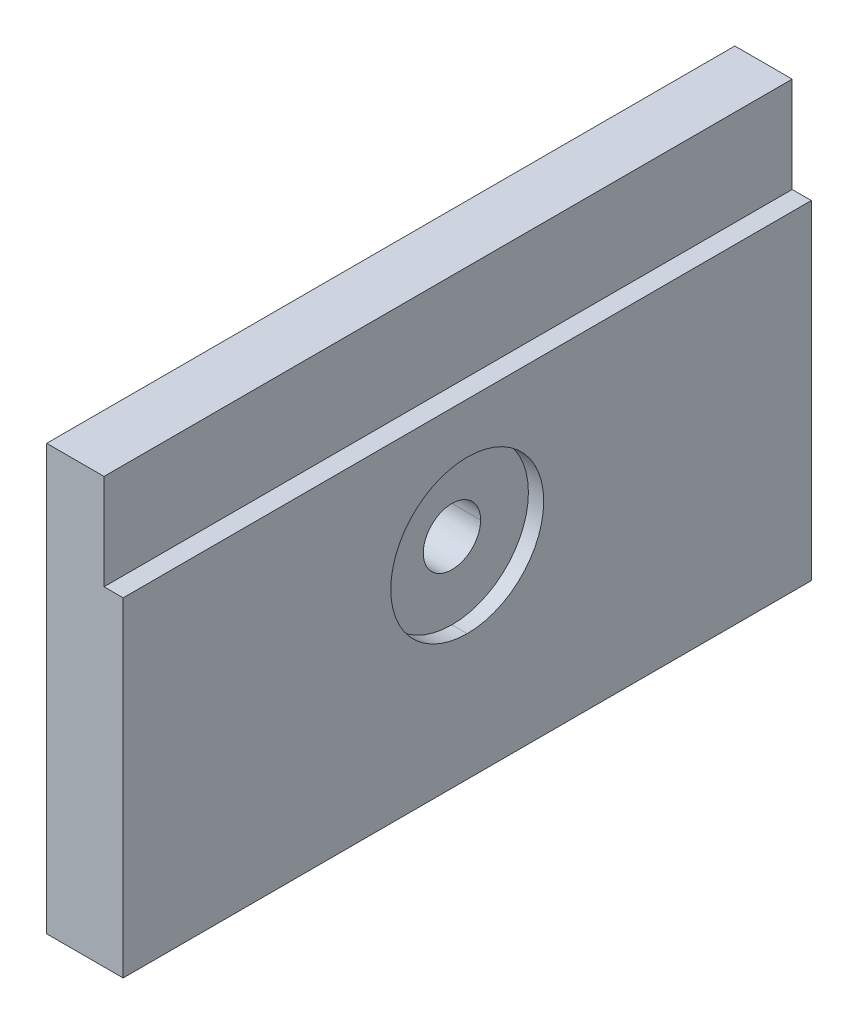
ISO-10303-21;
HEADER;
FILE_DESCRIPTION(('STEP AP214'),'2;1');
FILE_NAME('part.step','',(''),(''),'','','');
FILE_SCHEMA(('AUTOMOTIVE_DESIGN { 1 0 10303 214 1 1 1 1 }'));
ENDSEC;
DATA;
#1=APPLICATION_CONTEXT('core data for automotive mechanical design processes');
#2=APPLICATION_PROTOCOL_DEFINITION('international standard','automotive_design',2000,#1);
#3=PRODUCT_CONTEXT('',#1,'mechanical');
#4=PRODUCT('Part','Part','',(#3));
#5=PRODUCT_RELATED_PRODUCT_CATEGORY('part','',(#4));
#6=PRODUCT_DEFINITION_FORMATION('','',#4);
#7=PRODUCT_DEFINITION_CONTEXT('part definition',#1,'design');
#8=PRODUCT_DEFINITION('design','',#6,#7);
#9=PRODUCT_DEFINITION_SHAPE('','',#8);
#10=(LENGTH_UNIT() NAMED_UNIT(*) SI_UNIT(.MILLI.,.METRE.));
#11=(NAMED_UNIT(*) PLANE_ANGLE_UNIT() SI_UNIT($,.RADIAN.));
#12=(NAMED_UNIT(*) SI_UNIT($,.STERADIAN.) SOLID_ANGLE_UNIT());
#13=UNCERTAINTY_MEASURE_WITH_UNIT(LENGTH_MEASURE(1.E-05),#10,'distance_accuracy_value','');
#14=(GEOMETRIC_REPRESENTATION_CONTEXT(3) GLOBAL_UNCERTAINTY_ASSIGNED_CONTEXT((#13)) GLOBAL_UNIT_ASSIGNED_CONTEXT((#10,
#11,#12)) REPRESENTATION_CONTEXT('',''));
#15=CARTESIAN_POINT('',(0.,0.,0.));
#16=DIRECTION('',(0.,0.,1.));
#17=DIRECTION('',(1.,0.,0.));
#18=AXIS2_PLACEMENT_3D('',#15,#16,#17);
#19=CARTESIAN_POINT('',(-2.54,33.655,-57.15));
#20=DIRECTION('',(1.,0.,0.));
#21=DIRECTION('',(0.,1.,0.));
#22=AXIS2_PLACEMENT_3D('',#19,#20,#21);
#23=CYLINDRICAL_SURFACE('',#22,12.7);
#24=DIRECTION('',(1.,0.,0.));
#25=VECTOR('',#24,1.);
#26=CARTESIAN_POINT('',(-2.54,20.955,-57.15));
#27=LINE('',#26,#25);
#28=CARTESIAN_POINT('',(-2.54,20.955,-57.15));
#29=VERTEX_POINT('',#28);
#30=CARTESIAN_POINT('',(0.,20.955,-57.15));
#31=VERTEX_POINT('',#30);
#32=EDGE_CURVE('E128',#29,#31,#27,.T.);
#33=ORIENTED_EDGE('',*,*,#32,.F.);
#34=CARTESIAN_POINT('',(-2.54,33.655,-57.15));
#35=DIRECTION('',(1.,0.,0.));
#36=DIRECTION('',(0.,1.,0.));
#37=AXIS2_PLACEMENT_3D('',#34,#35,#36);
#38=CIRCLE('',#37,12.7);
#39=CARTESIAN_POINT('',(-2.54,46.355,-57.15));
#40=VERTEX_POINT('',#39);
#41=EDGE_CURVE('E11',#40,#29,#38,.T.);
#42=ORIENTED_EDGE('',*,*,#41,.F.);
#43=DIRECTION('',(1.,0.,0.));
#44=VECTOR('',#43,1.);
#45=CARTESIAN_POINT('',(-2.54,46.355,-57.15));
#46=LINE('',#45,#44);
#47=CARTESIAN_POINT('',(0.,46.355,-57.15));
#48=VERTEX_POINT('',#47);
#49=EDGE_CURVE('E137',#40,#48,#46,.T.);
#50=ORIENTED_EDGE('',*,*,#49,.T.);
#51=CARTESIAN_POINT('',(0.,33.655,-57.15));
#52=DIRECTION('',(1.,0.,0.));
#53=DIRECTION('',(0.,1.,0.));
#54=AXIS2_PLACEMENT_3D('',#51,#52,#53);
#55=CIRCLE('',#54,12.7);
#56=EDGE_CURVE('E129',#48,#31,#55,.T.);
#57=ORIENTED_EDGE('',*,*,#56,.T.);
#58=EDGE_LOOP('',(#33,#42,#50,#57));
#59=FACE_BOUND('',#58,.T.);
#60=ADVANCED_FACE('F17',(#59),#23,.F.);
#61=CARTESIAN_POINT('',(-2.54,33.655,-57.15));
#62=DIRECTION('',(1.,0.,0.));
#63=DIRECTION('',(0.,-1.,0.));
#64=AXIS2_PLACEMENT_3D('',#61,#62,#63);
#65=PLANE('',#64);
#66=CARTESIAN_POINT('',(-2.54,33.655,-57.15));
#67=DIRECTION('',(-1.,0.,0.));
#68=DIRECTION('',(0.,1.,0.));
#69=AXIS2_PLACEMENT_3D('',#66,#67,#68);
#70=CIRCLE('',#69,4.7625);
#71=CARTESIAN_POINT('',(-2.54,33.655,-61.9125));
#72=VERTEX_POINT('',#71);
#73=CARTESIAN_POINT('',(-2.54,33.655,-52.3875));
#74=VERTEX_POINT('',#73);
#75=EDGE_CURVE('E154',#72,#74,#70,.T.);
#76=ORIENTED_EDGE('',*,*,#75,.T.);
#77=CARTESIAN_POINT('',(-2.54,33.655,-57.15));
#78=DIRECTION('',(-1.,0.,0.));
#79=DIRECTION('',(0.,1.,0.));
#80=AXIS2_PLACEMENT_3D('',#77,#78,#79);
#81=CIRCLE('',#80,4.7625);
#82=EDGE_CURVE('E163',#74,#72,#81,.T.);
#83=ORIENTED_EDGE('',*,*,#82,.T.);
#84=EDGE_LOOP('',(#76,#83));
#85=FACE_BOUND('',#84,.T.);
#86=ORIENTED_EDGE('',*,*,#41,.T.);
#87=CARTESIAN_POINT('',(-2.54,33.655,-57.15));
#88=DIRECTION('',(1.,0.,0.));
#89=DIRECTION('',(0.,1.,0.));
#90=AXIS2_PLACEMENT_3D('',#87,#88,#89);
#91=CIRCLE('',#90,12.7);
#92=EDGE_CURVE('E123',#29,#40,#91,.T.);
#93=ORIENTED_EDGE('',*,*,#92,.T.);
#94=EDGE_LOOP('',(#86,#93));
#95=FACE_BOUND('',#94,.T.);
#96=ADVANCED_FACE('F121',(#85,#95),#65,.T.);
#97=CARTESIAN_POINT('',(0.,54.6862,0.));
#98=DIRECTION('',(0.,0.,1.));
#99=DIRECTION('',(1.,0.,0.));
#100=AXIS2_PLACEMENT_3D('',#97,#98,#99);
#101=PLANE('',#100);
#102=DIRECTION('',(0.,1.,0.));
#103=VECTOR('',#102,1.);
#104=CARTESIAN_POINT('',(0.,54.6862,0.));
#105=LINE('',#104,#103);
#106=CARTESIAN_POINT('',(0.,0.,0.));
#107=VERTEX_POINT('',#106);
#108=CARTESIAN_POINT('',(0.,54.6862,0.));
#109=VERTEX_POINT('',#108);
#110=EDGE_CURVE('E196',#107,#109,#105,.T.);
#111=ORIENTED_EDGE('',*,*,#110,.T.);
#112=DIRECTION('',(-1.,0.,0.));
#113=VECTOR('',#112,1.);
#114=CARTESIAN_POINT('',(-3.17500000000004,54.6862,0.));
#115=LINE('',#114,#113);
#116=CARTESIAN_POINT('',(-3.17500000000004,54.6862,0.));
#117=VERTEX_POINT('',#116);
#118=EDGE_CURVE('E20',#109,#117,#115,.T.);
#119=ORIENTED_EDGE('',*,*,#118,.T.);
#120=DIRECTION('',(0.,1.,0.));
#121=VECTOR('',#120,1.);
#122=CARTESIAN_POINT('',(-3.17500000000004,70.5612,0.));
#123=LINE('',#122,#121);
#124=CARTESIAN_POINT('',(-3.17500000000004,70.5612,0.));
#125=VERTEX_POINT('',#124);
#126=EDGE_CURVE('E207',#117,#125,#123,.T.);
#127=ORIENTED_EDGE('',*,*,#126,.T.);
#128=DIRECTION('',(-1.,0.,0.));
#129=VECTOR('',#128,1.);
#130=CARTESIAN_POINT('',(-12.7,70.5612,0.));
#131=LINE('',#130,#129);
#132=CARTESIAN_POINT('',(-12.7,70.5612,0.));
#133=VERTEX_POINT('',#132);
#134=EDGE_CURVE('E215',#125,#133,#131,.T.);
#135=ORIENTED_EDGE('',*,*,#134,.T.);
#136=DIRECTION('',(0.,-1.,0.));
#137=VECTOR('',#136,1.);
#138=CARTESIAN_POINT('',(-12.7,0.,0.));
#139=LINE('',#138,#137);
#140=CARTESIAN_POINT('',(-12.7,0.,0.));
#141=VERTEX_POINT('',#140);
#142=EDGE_CURVE('E160',#133,#141,#139,.T.);
#143=ORIENTED_EDGE('',*,*,#142,.T.);
#144=DIRECTION('',(1.,0.,0.));
#145=VECTOR('',#144,1.);
#146=CARTESIAN_POINT('',(0.,0.,0.));
#147=LINE('',#146,#145);
#148=EDGE_CURVE('E168',#141,#107,#147,.T.);
#149=ORIENTED_EDGE('',*,*,#148,.T.);
#150=EDGE_LOOP('',(#111,#119,#127,#135,#143,#149));
#151=FACE_BOUND('',#150,.T.);
#152=ADVANCED_FACE('F235',(#151),#101,.T.);
#153=CARTESIAN_POINT('',(0.,54.6862,-114.3));
#154=DIRECTION('',(0.,0.,1.));
#155=DIRECTION('',(1.,0.,0.));
#156=AXIS2_PLACEMENT_3D('',#153,#154,#155);
#157=PLANE('',#156);
#158=DIRECTION('',(0.,1.,0.));
#159=VECTOR('',#158,1.);
#160=CARTESIAN_POINT('',(0.,54.6862,-114.3));
#161=LINE('',#160,#159);
#162=CARTESIAN_POINT('',(0.,0.,-114.3));
#163=VERTEX_POINT('',#162);
#164=CARTESIAN_POINT('',(0.,54.6862,-114.3));
#165=VERTEX_POINT('',#164);
#166=EDGE_CURVE('E143',#163,#165,#161,.T.);
#167=ORIENTED_EDGE('',*,*,#166,.F.);
#168=DIRECTION('',(1.,0.,0.));
#169=VECTOR('',#168,1.);
#170=CARTESIAN_POINT('',(0.,0.,-114.3));
#171=LINE('',#170,#169);
#172=CARTESIAN_POINT('',(-12.7,0.,-114.3));
#173=VERTEX_POINT('',#172);
#174=EDGE_CURVE('E190',#173,#163,#171,.T.);
#175=ORIENTED_EDGE('',*,*,#174,.F.);
#176=DIRECTION('',(0.,-1.,0.));
#177=VECTOR('',#176,1.);
#178=CARTESIAN_POINT('',(-12.7,0.,-114.3));
#179=LINE('',#178,#177);
#180=CARTESIAN_POINT('',(-12.7,70.5612,-114.3));
#181=VERTEX_POINT('',#180);
#182=EDGE_CURVE('E159',#181,#173,#179,.T.);
#183=ORIENTED_EDGE('',*,*,#182,.F.);
#184=DIRECTION('',(-1.,0.,0.));
#185=VECTOR('',#184,1.);
#186=CARTESIAN_POINT('',(-12.7,70.5612,-114.3));
#187=LINE('',#186,#185);
#188=CARTESIAN_POINT('',(-3.17500000000004,70.5612,-114.3));
#189=VERTEX_POINT('',#188);
#190=EDGE_CURVE('E204',#189,#181,#187,.T.);
#191=ORIENTED_EDGE('',*,*,#190,.F.);
#192=DIRECTION('',(0.,1.,0.));
#193=VECTOR('',#192,1.);
#194=CARTESIAN_POINT('',(-3.17500000000004,70.5612,-114.3));
#195=LINE('',#194,#193);
#196=CARTESIAN_POINT('',(-3.17500000000004,54.6862,-114.3));
#197=VERTEX_POINT('',#196);
#198=EDGE_CURVE('E182',#197,#189,#195,.T.);
#199=ORIENTED_EDGE('',*,*,#198,.F.);
#200=DIRECTION('',(-1.,0.,0.));
#201=VECTOR('',#200,1.);
#202=CARTESIAN_POINT('',(-3.17500000000004,54.6862,-114.3));
#203=LINE('',#202,#201);
#204=EDGE_CURVE('E26',#165,#197,#203,.T.);
#205=ORIENTED_EDGE('',*,*,#204,.F.);
#206=EDGE_LOOP('',(#167,#175,#183,#191,#199,#205));
#207=FACE_BOUND('',#206,.T.);
#208=ADVANCED_FACE('F255',(#207),#157,.F.);
#209=CARTESIAN_POINT('',(-3.17500000000004,54.6862,-114.3));
#210=DIRECTION('',(0.,1.,0.));
#211=DIRECTION('',(1.,0.,0.));
#212=AXIS2_PLACEMENT_3D('',#209,#210,#211);
#213=PLANE('',#212);
#214=ORIENTED_EDGE('',*,*,#118,.F.);
#215=DIRECTION('',(0.,0.,1.));
#216=VECTOR('',#215,1.);
#217=CARTESIAN_POINT('',(0.,54.6862,-114.3));
#218=LINE('',#217,#216);
#219=EDGE_CURVE('E147',#165,#109,#218,.T.);
#220=ORIENTED_EDGE('',*,*,#219,.F.);
#221=ORIENTED_EDGE('',*,*,#204,.T.);
#222=DIRECTION('',(0.,0.,1.));
#223=VECTOR('',#222,1.);
#224=CARTESIAN_POINT('',(-3.17500000000004,54.6862,-114.3));
#225=LINE('',#224,#223);
#226=EDGE_CURVE('E185',#197,#117,#225,.T.);
#227=ORIENTED_EDGE('',*,*,#226,.T.);
#228=EDGE_LOOP('',(#214,#220,#221,#227));
#229=FACE_BOUND('',#228,.T.);
#230=ADVANCED_FACE('F230',(#229),#213,.T.);
#231=CARTESIAN_POINT('',(-3.17500000000004,70.5612,-114.3));
#232=DIRECTION('',(1.,0.,0.));
#233=DIRECTION('',(0.,1.,0.));
#234=AXIS2_PLACEMENT_3D('',#231,#232,#233);
#235=PLANE('',#234);
#236=ORIENTED_EDGE('',*,*,#126,.F.);
#237=ORIENTED_EDGE('',*,*,#226,.F.);
#238=ORIENTED_EDGE('',*,*,#198,.T.);
#239=DIRECTION('',(0.,0.,1.));
#240=VECTOR('',#239,1.);
#241=CARTESIAN_POINT('',(-3.17500000000004,70.5612,-114.3));
#242=LINE('',#241,#240);
#243=EDGE_CURVE('E208',#189,#125,#242,.T.);
#244=ORIENTED_EDGE('',*,*,#243,.T.);
#245=EDGE_LOOP('',(#236,#237,#238,#244));
#246=FACE_BOUND('',#245,.T.);
#247=ADVANCED_FACE('F232',(#246),#235,.T.);
#248=CARTESIAN_POINT('',(-12.7,70.5612,-114.3));
#249=DIRECTION('',(0.,1.,0.));
#250=DIRECTION('',(1.,0.,0.));
#251=AXIS2_PLACEMENT_3D('',#248,#249,#250);
#252=PLANE('',#251);
#253=ORIENTED_EDGE('',*,*,#134,.F.);
#254=ORIENTED_EDGE('',*,*,#243,.F.);
#255=ORIENTED_EDGE('',*,*,#190,.T.);
#256=DIRECTION('',(0.,0.,1.));
#257=VECTOR('',#256,1.);
#258=CARTESIAN_POINT('',(-12.7,70.5612,-114.3));
#259=LINE('',#258,#257);
#260=EDGE_CURVE('E155',#181,#133,#259,.T.);
#261=ORIENTED_EDGE('',*,*,#260,.T.);
#262=EDGE_LOOP('',(#253,#254,#255,#261));
#263=FACE_BOUND('',#262,.T.);
#264=ADVANCED_FACE('F239',(#263),#252,.T.);
#265=CARTESIAN_POINT('',(-12.7,0.,-114.3));
#266=DIRECTION('',(-1.,0.,0.));
#267=DIRECTION('',(0.,0.,1.));
#268=AXIS2_PLACEMENT_3D('',#265,#266,#267);
#269=PLANE('',#268);
#270=CARTESIAN_POINT('',(-12.7,33.655,-57.15));
#271=DIRECTION('',(1.,0.,0.));
#272=DIRECTION('',(0.,0.,1.));
#273=AXIS2_PLACEMENT_3D('',#270,#271,#272);
#274=CIRCLE('',#273,4.7625);
#275=CARTESIAN_POINT('',(-12.7,33.655,-61.9125));
#276=VERTEX_POINT('',#275);
#277=CARTESIAN_POINT('',(-12.7,33.655,-52.3875));
#278=VERTEX_POINT('',#277);
#279=EDGE_CURVE('E153',#276,#278,#274,.T.);
#280=ORIENTED_EDGE('',*,*,#279,.T.);
#281=CARTESIAN_POINT('',(-12.7,33.655,-57.15));
#282=DIRECTION('',(1.,0.,0.));
#283=DIRECTION('',(0.,0.,1.));
#284=AXIS2_PLACEMENT_3D('',#281,#282,#283);
#285=CIRCLE('',#284,4.7625);
#286=EDGE_CURVE('E171',#278,#276,#285,.T.);
#287=ORIENTED_EDGE('',*,*,#286,.T.);
#288=EDGE_LOOP('',(#280,#287));
#289=FACE_BOUND('',#288,.T.);
#290=ORIENTED_EDGE('',*,*,#142,.F.);
#291=ORIENTED_EDGE('',*,*,#260,.F.);
#292=ORIENTED_EDGE('',*,*,#182,.T.);
#293=DIRECTION('',(0.,0.,1.));
#294=VECTOR('',#293,1.);
#295=CARTESIAN_POINT('',(-12.7,0.,-114.3));
#296=LINE('',#295,#294);
#297=EDGE_CURVE('E186',#173,#141,#296,.T.);
#298=ORIENTED_EDGE('',*,*,#297,.T.);
#299=EDGE_LOOP('',(#290,#291,#292,#298));
#300=FACE_BOUND('',#299,.T.);
#301=ADVANCED_FACE('F243',(#289,#300),#269,.T.);
#302=CARTESIAN_POINT('',(0.,0.,-114.3));
#303=DIRECTION('',(0.,-1.,0.));
#304=DIRECTION('',(0.,0.,-1.));
#305=AXIS2_PLACEMENT_3D('',#302,#303,#304);
#306=PLANE('',#305);
#307=ORIENTED_EDGE('',*,*,#148,.F.);
#308=ORIENTED_EDGE('',*,*,#297,.F.);
#309=ORIENTED_EDGE('',*,*,#174,.T.);
#310=DIRECTION('',(0.,0.,1.));
#311=VECTOR('',#310,1.);
#312=CARTESIAN_POINT('',(0.,0.,-114.3));
#313=LINE('',#312,#311);
#314=EDGE_CURVE('E148',#163,#107,#313,.T.);
#315=ORIENTED_EDGE('',*,*,#314,.T.);
#316=EDGE_LOOP('',(#307,#308,#309,#315));
#317=FACE_BOUND('',#316,.T.);
#318=ADVANCED_FACE('F248',(#317),#306,.T.);
#319=CARTESIAN_POINT('',(0.,54.6862,-114.3));
#320=DIRECTION('',(1.,0.,0.));
#321=DIRECTION('',(0.,-1.,0.));
#322=AXIS2_PLACEMENT_3D('',#319,#320,#321);
#323=PLANE('',#322);
#324=ORIENTED_EDGE('',*,*,#56,.F.);
#325=CARTESIAN_POINT('',(0.,33.655,-57.15));
#326=DIRECTION('',(1.,0.,0.));
#327=DIRECTION('',(0.,1.,0.));
#328=AXIS2_PLACEMENT_3D('',#325,#326,#327);
#329=CIRCLE('',#328,12.7);
#330=EDGE_CURVE('E134',#31,#48,#329,.T.);
#331=ORIENTED_EDGE('',*,*,#330,.F.);
#332=EDGE_LOOP('',(#324,#331));
#333=FACE_BOUND('',#332,.T.);
#334=ORIENTED_EDGE('',*,*,#110,.F.);
#335=ORIENTED_EDGE('',*,*,#314,.F.);
#336=ORIENTED_EDGE('',*,*,#166,.T.);
#337=ORIENTED_EDGE('',*,*,#219,.T.);
#338=EDGE_LOOP('',(#334,#335,#336,#337));
#339=FACE_BOUND('',#338,.T.);
#340=ADVANCED_FACE('F252',(#333,#339),#323,.T.);
#341=CARTESIAN_POINT('',(-26.1703841816037,33.655,-57.15));
#342=DIRECTION('',(1.,0.,0.));
#343=DIRECTION('',(0.,0.,-1.));
#344=AXIS2_PLACEMENT_3D('',#341,#342,#343);
#345=CYLINDRICAL_SURFACE('',#344,4.7625);
#346=DIRECTION('',(1.,0.,0.));
#347=VECTOR('',#346,1.);
#348=CARTESIAN_POINT('',(-26.1703841816037,33.655,-52.3875));
#349=LINE('',#348,#347);
#350=EDGE_CURVE('E175',#278,#74,#349,.T.);
#351=ORIENTED_EDGE('',*,*,#350,.F.);
#352=ORIENTED_EDGE('',*,*,#279,.F.);
#353=DIRECTION('',(1.,0.,0.));
#354=VECTOR('',#353,1.);
#355=CARTESIAN_POINT('',(-26.1703841816037,33.655,-61.9125));
#356=LINE('',#355,#354);
#357=EDGE_CURVE('E149',#276,#72,#356,.T.);
#358=ORIENTED_EDGE('',*,*,#357,.T.);
#359=ORIENTED_EDGE('',*,*,#82,.F.);
#360=EDGE_LOOP('',(#351,#352,#358,#359));
#361=FACE_BOUND('',#360,.T.);
#362=ADVANCED_FACE('F278',(#361),#345,.F.);
#363=CARTESIAN_POINT('',(-26.1703841816037,33.655,-57.15));
#364=DIRECTION('',(1.,0.,0.));
#365=DIRECTION('',(0.,0.,-1.));
#366=AXIS2_PLACEMENT_3D('',#363,#364,#365);
#367=CYLINDRICAL_SURFACE('',#366,4.7625);
#368=ORIENTED_EDGE('',*,*,#286,.F.);
#369=ORIENTED_EDGE('',*,*,#350,.T.);
#370=ORIENTED_EDGE('',*,*,#75,.F.);
#371=ORIENTED_EDGE('',*,*,#357,.F.);
#372=EDGE_LOOP('',(#368,#369,#370,#371));
#373=FACE_BOUND('',#372,.T.);
#374=ADVANCED_FACE('F299',(#373),#367,.F.);
#375=CARTESIAN_POINT('',(-2.54,33.655,-57.15));
#376=DIRECTION('',(1.,0.,0.));
#377=DIRECTION('',(0.,1.,0.));
#378=AXIS2_PLACEMENT_3D('',#375,#376,#377);
#379=CYLINDRICAL_SURFACE('',#378,12.7);
#380=ORIENTED_EDGE('',*,*,#92,.F.);
#381=ORIENTED_EDGE('',*,*,#32,.T.);
#382=ORIENTED_EDGE('',*,*,#330,.T.);
#383=ORIENTED_EDGE('',*,*,#49,.F.);
#384=EDGE_LOOP('',(#380,#381,#382,#383));
#385=FACE_BOUND('',#384,.T.);
#386=ADVANCED_FACE('F136',(#385),#379,.F.);
#387=CLOSED_SHELL('',(#60,#96,#152,#208,#230,#247,#264,#301,#318,#340,#362,#374,#386));
#388=MANIFOLD_SOLID_BREP('B1',#387);
#389=ADVANCED_BREP_SHAPE_REPRESENTATION('',(#18,#388),#14);
#390=SHAPE_DEFINITION_REPRESENTATION(#9,#389);
ENDSEC;
END-ISO-10303-21;
